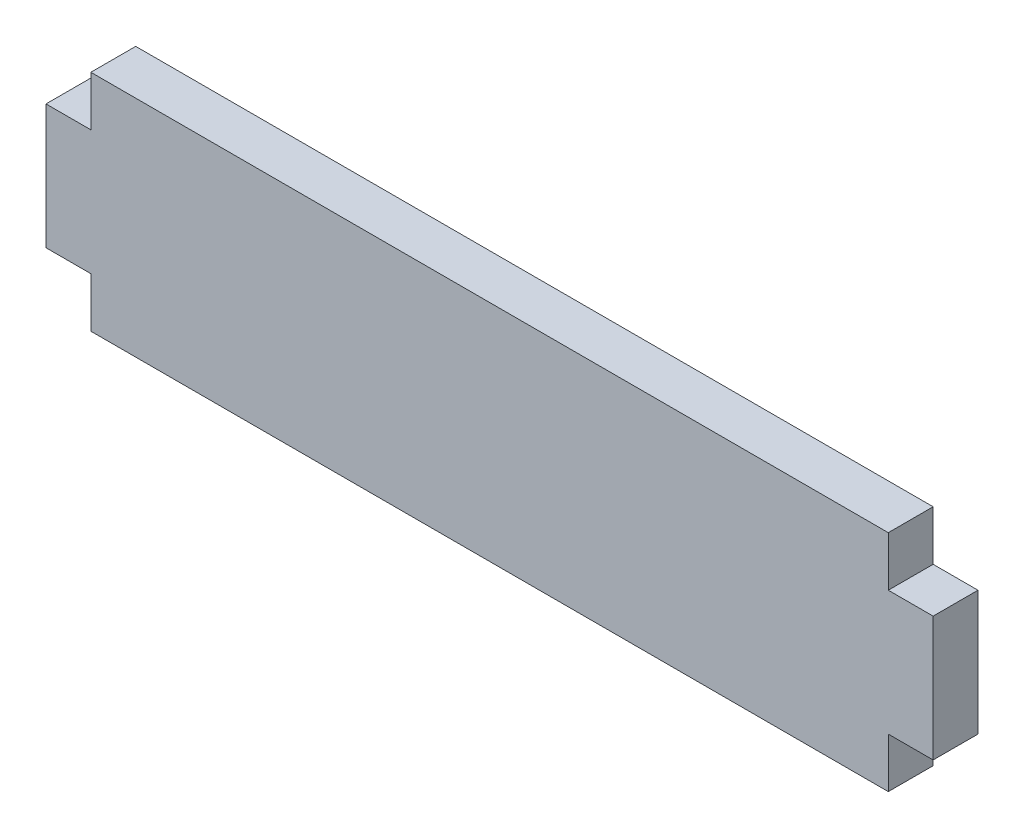
ISO-10303-21;
HEADER;
FILE_DESCRIPTION(('STEP AP214'),'2;1');
FILE_NAME('part.step','',(''),(''),'','','');
FILE_SCHEMA(('AUTOMOTIVE_DESIGN { 1 0 10303 214 1 1 1 1 }'));
ENDSEC;
DATA;
#1=APPLICATION_CONTEXT('core data for automotive mechanical design processes');
#2=APPLICATION_PROTOCOL_DEFINITION('international standard','automotive_design',2000,#1);
#3=PRODUCT_CONTEXT('',#1,'mechanical');
#4=PRODUCT('Part','Part','',(#3));
#5=PRODUCT_RELATED_PRODUCT_CATEGORY('part','',(#4));
#6=PRODUCT_DEFINITION_FORMATION('','',#4);
#7=PRODUCT_DEFINITION_CONTEXT('part definition',#1,'design');
#8=PRODUCT_DEFINITION('design','',#6,#7);
#9=PRODUCT_DEFINITION_SHAPE('','',#8);
#10=(LENGTH_UNIT() NAMED_UNIT(*) SI_UNIT(.MILLI.,.METRE.));
#11=(NAMED_UNIT(*) PLANE_ANGLE_UNIT() SI_UNIT($,.RADIAN.));
#12=(NAMED_UNIT(*) SI_UNIT($,.STERADIAN.) SOLID_ANGLE_UNIT());
#13=UNCERTAINTY_MEASURE_WITH_UNIT(LENGTH_MEASURE(1.E-05),#10,'distance_accuracy_value','');
#14=(GEOMETRIC_REPRESENTATION_CONTEXT(3) GLOBAL_UNCERTAINTY_ASSIGNED_CONTEXT((#13)) GLOBAL_UNIT_ASSIGNED_CONTEXT((#10,
#11,#12)) REPRESENTATION_CONTEXT('',''));
#15=CARTESIAN_POINT('',(0.,0.,0.));
#16=DIRECTION('',(0.,0.,1.));
#17=DIRECTION('',(1.,0.,0.));
#18=AXIS2_PLACEMENT_3D('',#15,#16,#17);
#19=CARTESIAN_POINT('',(160.,-7.10843373493977,18.));
#20=DIRECTION('',(-1.,0.,0.));
#21=DIRECTION('',(0.,0.,1.));
#22=AXIS2_PLACEMENT_3D('',#19,#20,#21);
#23=PLANE('',#22);
#24=DIRECTION('',(0.,1.,0.));
#25=VECTOR('',#24,1.);
#26=CARTESIAN_POINT('',(160.,-7.10843373493977,0.));
#27=LINE('',#26,#25);
#28=CARTESIAN_POINT('',(160.,-27.1084337349397,0.));
#29=VERTEX_POINT('',#28);
#30=CARTESIAN_POINT('',(160.,-7.10843373493977,0.));
#31=VERTEX_POINT('',#30);
#32=EDGE_CURVE('E153',#29,#31,#27,.T.);
#33=ORIENTED_EDGE('',*,*,#32,.T.);
#34=DIRECTION('',(0.,0.,-1.));
#35=VECTOR('',#34,1.);
#36=CARTESIAN_POINT('',(160.,-7.10843373493977,18.));
#37=LINE('',#36,#35);
#38=CARTESIAN_POINT('',(160.,-7.10843373493977,18.));
#39=VERTEX_POINT('',#38);
#40=EDGE_CURVE('E11',#39,#31,#37,.T.);
#41=ORIENTED_EDGE('',*,*,#40,.F.);
#42=DIRECTION('',(0.,1.,0.));
#43=VECTOR('',#42,1.);
#44=CARTESIAN_POINT('',(160.,-7.10843373493977,18.));
#45=LINE('',#44,#43);
#46=CARTESIAN_POINT('',(160.,-27.1084337349397,18.));
#47=VERTEX_POINT('',#46);
#48=EDGE_CURVE('E175',#47,#39,#45,.T.);
#49=ORIENTED_EDGE('',*,*,#48,.F.);
#50=DIRECTION('',(0.,0.,-1.));
#51=VECTOR('',#50,1.);
#52=CARTESIAN_POINT('',(160.,-27.1084337349397,18.));
#53=LINE('',#52,#51);
#54=EDGE_CURVE('E149',#47,#29,#53,.T.);
#55=ORIENTED_EDGE('',*,*,#54,.T.);
#56=EDGE_LOOP('',(#33,#41,#49,#55));
#57=FACE_BOUND('',#56,.T.);
#58=ADVANCED_FACE('F33',(#57),#23,.F.);
#59=CARTESIAN_POINT('',(160.,-7.10843373493977,18.));
#60=DIRECTION('',(0.,1.,0.));
#61=DIRECTION('',(0.,0.,1.));
#62=AXIS2_PLACEMENT_3D('',#59,#60,#61);
#63=PLANE('',#62);
#64=DIRECTION('',(1.,0.,0.));
#65=VECTOR('',#64,1.);
#66=CARTESIAN_POINT('',(160.,-7.10843373493977,0.));
#67=LINE('',#66,#65);
#68=CARTESIAN_POINT('',(178.,-7.10843373493977,0.));
#69=VERTEX_POINT('',#68);
#70=EDGE_CURVE('E156',#31,#69,#67,.T.);
#71=ORIENTED_EDGE('',*,*,#70,.T.);
#72=DIRECTION('',(0.,0.,-1.));
#73=VECTOR('',#72,1.);
#74=CARTESIAN_POINT('',(178.,-7.10843373493977,18.));
#75=LINE('',#74,#73);
#76=CARTESIAN_POINT('',(178.,-7.10843373493977,18.));
#77=VERTEX_POINT('',#76);
#78=EDGE_CURVE('E41',#77,#69,#75,.T.);
#79=ORIENTED_EDGE('',*,*,#78,.F.);
#80=DIRECTION('',(1.,0.,0.));
#81=VECTOR('',#80,1.);
#82=CARTESIAN_POINT('',(160.,-7.10843373493977,18.));
#83=LINE('',#82,#81);
#84=EDGE_CURVE('E104',#39,#77,#83,.T.);
#85=ORIENTED_EDGE('',*,*,#84,.F.);
#86=ORIENTED_EDGE('',*,*,#40,.T.);
#87=EDGE_LOOP('',(#71,#79,#85,#86));
#88=FACE_BOUND('',#87,.T.);
#89=ADVANCED_FACE('F253',(#88),#63,.F.);
#90=CARTESIAN_POINT('',(178.,42.8915662650602,18.));
#91=DIRECTION('',(-1.,0.,0.));
#92=DIRECTION('',(0.,-1.,0.));
#93=AXIS2_PLACEMENT_3D('',#90,#91,#92);
#94=PLANE('',#93);
#95=DIRECTION('',(0.,1.,0.));
#96=VECTOR('',#95,1.);
#97=CARTESIAN_POINT('',(178.,42.8915662650602,0.));
#98=LINE('',#97,#96);
#99=CARTESIAN_POINT('',(178.,42.8915662650602,0.));
#100=VERTEX_POINT('',#99);
#101=EDGE_CURVE('E158',#69,#100,#98,.T.);
#102=ORIENTED_EDGE('',*,*,#101,.T.);
#103=DIRECTION('',(0.,0.,-1.));
#104=VECTOR('',#103,1.);
#105=CARTESIAN_POINT('',(178.,42.8915662650602,18.));
#106=LINE('',#105,#104);
#107=CARTESIAN_POINT('',(178.,42.8915662650602,18.));
#108=VERTEX_POINT('',#107);
#109=EDGE_CURVE('E194',#108,#100,#106,.T.);
#110=ORIENTED_EDGE('',*,*,#109,.F.);
#111=DIRECTION('',(0.,1.,0.));
#112=VECTOR('',#111,1.);
#113=CARTESIAN_POINT('',(178.,42.8915662650602,18.));
#114=LINE('',#113,#112);
#115=EDGE_CURVE('E202',#77,#108,#114,.T.);
#116=ORIENTED_EDGE('',*,*,#115,.F.);
#117=ORIENTED_EDGE('',*,*,#78,.T.);
#118=EDGE_LOOP('',(#102,#110,#116,#117));
#119=FACE_BOUND('',#118,.T.);
#120=ADVANCED_FACE('F200',(#119),#94,.F.);
#121=CARTESIAN_POINT('',(160.,42.8915662650602,18.));
#122=DIRECTION('',(0.,-1.,0.));
#123=DIRECTION('',(0.,0.,-1.));
#124=AXIS2_PLACEMENT_3D('',#121,#122,#123);
#125=PLANE('',#124);
#126=DIRECTION('',(-1.,0.,0.));
#127=VECTOR('',#126,1.);
#128=CARTESIAN_POINT('',(160.,42.8915662650602,0.));
#129=LINE('',#128,#127);
#130=CARTESIAN_POINT('',(160.,42.8915662650602,0.));
#131=VERTEX_POINT('',#130);
#132=EDGE_CURVE('E160',#100,#131,#129,.T.);
#133=ORIENTED_EDGE('',*,*,#132,.T.);
#134=DIRECTION('',(0.,0.,-1.));
#135=VECTOR('',#134,1.);
#136=CARTESIAN_POINT('',(160.,42.8915662650602,18.));
#137=LINE('',#136,#135);
#138=CARTESIAN_POINT('',(160.,42.8915662650602,18.));
#139=VERTEX_POINT('',#138);
#140=EDGE_CURVE('E191',#139,#131,#137,.T.);
#141=ORIENTED_EDGE('',*,*,#140,.F.);
#142=DIRECTION('',(-1.,0.,0.));
#143=VECTOR('',#142,1.);
#144=CARTESIAN_POINT('',(160.,42.8915662650602,18.));
#145=LINE('',#144,#143);
#146=EDGE_CURVE('E220',#108,#139,#145,.T.);
#147=ORIENTED_EDGE('',*,*,#146,.F.);
#148=ORIENTED_EDGE('',*,*,#109,.T.);
#149=EDGE_LOOP('',(#133,#141,#147,#148));
#150=FACE_BOUND('',#149,.T.);
#151=ADVANCED_FACE('F211',(#150),#125,.F.);
#152=CARTESIAN_POINT('',(160.,62.8915662650603,18.));
#153=DIRECTION('',(-1.,0.,0.));
#154=DIRECTION('',(0.,0.,1.));
#155=AXIS2_PLACEMENT_3D('',#152,#153,#154);
#156=PLANE('',#155);
#157=DIRECTION('',(0.,1.,0.));
#158=VECTOR('',#157,1.);
#159=CARTESIAN_POINT('',(160.,62.8915662650603,0.));
#160=LINE('',#159,#158);
#161=CARTESIAN_POINT('',(160.,62.8915662650603,0.));
#162=VERTEX_POINT('',#161);
#163=EDGE_CURVE('E162',#131,#162,#160,.T.);
#164=ORIENTED_EDGE('',*,*,#163,.T.);
#165=DIRECTION('',(0.,0.,-1.));
#166=VECTOR('',#165,1.);
#167=CARTESIAN_POINT('',(160.,62.8915662650603,18.));
#168=LINE('',#167,#166);
#169=CARTESIAN_POINT('',(160.,62.8915662650603,18.));
#170=VERTEX_POINT('',#169);
#171=EDGE_CURVE('E188',#170,#162,#168,.T.);
#172=ORIENTED_EDGE('',*,*,#171,.F.);
#173=DIRECTION('',(0.,1.,0.));
#174=VECTOR('',#173,1.);
#175=CARTESIAN_POINT('',(160.,62.8915662650603,18.));
#176=LINE('',#175,#174);
#177=EDGE_CURVE('E217',#139,#170,#176,.T.);
#178=ORIENTED_EDGE('',*,*,#177,.F.);
#179=ORIENTED_EDGE('',*,*,#140,.T.);
#180=EDGE_LOOP('',(#164,#172,#178,#179));
#181=FACE_BOUND('',#180,.T.);
#182=ADVANCED_FACE('F215',(#181),#156,.F.);
#183=CARTESIAN_POINT('',(-160.,62.8915662650603,18.));
#184=DIRECTION('',(0.,-1.,0.));
#185=DIRECTION('',(0.,0.,-1.));
#186=AXIS2_PLACEMENT_3D('',#183,#184,#185);
#187=PLANE('',#186);
#188=DIRECTION('',(-1.,0.,0.));
#189=VECTOR('',#188,1.);
#190=CARTESIAN_POINT('',(-160.,62.8915662650603,0.));
#191=LINE('',#190,#189);
#192=CARTESIAN_POINT('',(-160.,62.8915662650603,0.));
#193=VERTEX_POINT('',#192);
#194=EDGE_CURVE('E164',#162,#193,#191,.T.);
#195=ORIENTED_EDGE('',*,*,#194,.T.);
#196=DIRECTION('',(0.,0.,-1.));
#197=VECTOR('',#196,1.);
#198=CARTESIAN_POINT('',(-160.,62.8915662650603,18.));
#199=LINE('',#198,#197);
#200=CARTESIAN_POINT('',(-160.,62.8915662650603,18.));
#201=VERTEX_POINT('',#200);
#202=EDGE_CURVE('E185',#201,#193,#199,.T.);
#203=ORIENTED_EDGE('',*,*,#202,.F.);
#204=DIRECTION('',(-1.,0.,0.));
#205=VECTOR('',#204,1.);
#206=CARTESIAN_POINT('',(-160.,62.8915662650603,18.));
#207=LINE('',#206,#205);
#208=EDGE_CURVE('E219',#170,#201,#207,.T.);
#209=ORIENTED_EDGE('',*,*,#208,.F.);
#210=ORIENTED_EDGE('',*,*,#171,.T.);
#211=EDGE_LOOP('',(#195,#203,#209,#210));
#212=FACE_BOUND('',#211,.T.);
#213=ADVANCED_FACE('F266',(#212),#187,.F.);
#214=CARTESIAN_POINT('',(-160.,62.8915662650603,18.));
#215=DIRECTION('',(1.,0.,0.));
#216=DIRECTION('',(0.,1.,0.));
#217=AXIS2_PLACEMENT_3D('',#214,#215,#216);
#218=PLANE('',#217);
#219=DIRECTION('',(0.,-1.,0.));
#220=VECTOR('',#219,1.);
#221=CARTESIAN_POINT('',(-160.,62.8915662650603,0.));
#222=LINE('',#221,#220);
#223=CARTESIAN_POINT('',(-160.,42.8915662650602,0.));
#224=VERTEX_POINT('',#223);
#225=EDGE_CURVE('E166',#193,#224,#222,.T.);
#226=ORIENTED_EDGE('',*,*,#225,.T.);
#227=DIRECTION('',(0.,0.,-1.));
#228=VECTOR('',#227,1.);
#229=CARTESIAN_POINT('',(-160.,42.8915662650602,18.));
#230=LINE('',#229,#228);
#231=CARTESIAN_POINT('',(-160.,42.8915662650602,18.));
#232=VERTEX_POINT('',#231);
#233=EDGE_CURVE('E182',#232,#224,#230,.T.);
#234=ORIENTED_EDGE('',*,*,#233,.F.);
#235=DIRECTION('',(0.,-1.,0.));
#236=VECTOR('',#235,1.);
#237=CARTESIAN_POINT('',(-160.,62.8915662650603,18.));
#238=LINE('',#237,#236);
#239=EDGE_CURVE('E222',#201,#232,#238,.T.);
#240=ORIENTED_EDGE('',*,*,#239,.F.);
#241=ORIENTED_EDGE('',*,*,#202,.T.);
#242=EDGE_LOOP('',(#226,#234,#240,#241));
#243=FACE_BOUND('',#242,.T.);
#244=ADVANCED_FACE('F269',(#243),#218,.F.);
#245=CARTESIAN_POINT('',(-160.,42.8915662650602,18.));
#246=DIRECTION('',(0.,-1.,0.));
#247=DIRECTION('',(0.,0.,-1.));
#248=AXIS2_PLACEMENT_3D('',#245,#246,#247);
#249=PLANE('',#248);
#250=DIRECTION('',(-1.,0.,0.));
#251=VECTOR('',#250,1.);
#252=CARTESIAN_POINT('',(-160.,42.8915662650602,0.));
#253=LINE('',#252,#251);
#254=CARTESIAN_POINT('',(-178.,42.8915662650602,0.));
#255=VERTEX_POINT('',#254);
#256=EDGE_CURVE('E168',#224,#255,#253,.T.);
#257=ORIENTED_EDGE('',*,*,#256,.T.);
#258=DIRECTION('',(0.,0.,-1.));
#259=VECTOR('',#258,1.);
#260=CARTESIAN_POINT('',(-178.,42.8915662650602,18.));
#261=LINE('',#260,#259);
#262=CARTESIAN_POINT('',(-178.,42.8915662650602,18.));
#263=VERTEX_POINT('',#262);
#264=EDGE_CURVE('E179',#263,#255,#261,.T.);
#265=ORIENTED_EDGE('',*,*,#264,.F.);
#266=DIRECTION('',(-1.,0.,0.));
#267=VECTOR('',#266,1.);
#268=CARTESIAN_POINT('',(-160.,42.8915662650602,18.));
#269=LINE('',#268,#267);
#270=EDGE_CURVE('E228',#232,#263,#269,.T.);
#271=ORIENTED_EDGE('',*,*,#270,.F.);
#272=ORIENTED_EDGE('',*,*,#233,.T.);
#273=EDGE_LOOP('',(#257,#265,#271,#272));
#274=FACE_BOUND('',#273,.T.);
#275=ADVANCED_FACE('F234',(#274),#249,.F.);
#276=CARTESIAN_POINT('',(-178.,42.8915662650602,18.));
#277=DIRECTION('',(1.,0.,0.));
#278=DIRECTION('',(0.,1.,0.));
#279=AXIS2_PLACEMENT_3D('',#276,#277,#278);
#280=PLANE('',#279);
#281=DIRECTION('',(0.,-1.,0.));
#282=VECTOR('',#281,1.);
#283=CARTESIAN_POINT('',(-178.,42.8915662650602,0.));
#284=LINE('',#283,#282);
#285=CARTESIAN_POINT('',(-178.,-7.10843373493976,0.));
#286=VERTEX_POINT('',#285);
#287=EDGE_CURVE('E170',#255,#286,#284,.T.);
#288=ORIENTED_EDGE('',*,*,#287,.T.);
#289=DIRECTION('',(0.,0.,-1.));
#290=VECTOR('',#289,1.);
#291=CARTESIAN_POINT('',(-178.,-7.10843373493976,18.));
#292=LINE('',#291,#290);
#293=CARTESIAN_POINT('',(-178.,-7.10843373493976,18.));
#294=VERTEX_POINT('',#293);
#295=EDGE_CURVE('E144',#294,#286,#292,.T.);
#296=ORIENTED_EDGE('',*,*,#295,.F.);
#297=DIRECTION('',(0.,-1.,0.));
#298=VECTOR('',#297,1.);
#299=CARTESIAN_POINT('',(-178.,42.8915662650602,18.));
#300=LINE('',#299,#298);
#301=EDGE_CURVE('E135',#263,#294,#300,.T.);
#302=ORIENTED_EDGE('',*,*,#301,.F.);
#303=ORIENTED_EDGE('',*,*,#264,.T.);
#304=EDGE_LOOP('',(#288,#296,#302,#303));
#305=FACE_BOUND('',#304,.T.);
#306=ADVANCED_FACE('F238',(#305),#280,.F.);
#307=CARTESIAN_POINT('',(-160.,-7.10843373493976,18.));
#308=DIRECTION('',(0.,1.,0.));
#309=DIRECTION('',(0.,0.,1.));
#310=AXIS2_PLACEMENT_3D('',#307,#308,#309);
#311=PLANE('',#310);
#312=DIRECTION('',(1.,0.,0.));
#313=VECTOR('',#312,1.);
#314=CARTESIAN_POINT('',(-160.,-7.10843373493976,0.));
#315=LINE('',#314,#313);
#316=CARTESIAN_POINT('',(-160.,-7.10843373493976,0.));
#317=VERTEX_POINT('',#316);
#318=EDGE_CURVE('E143',#286,#317,#315,.T.);
#319=ORIENTED_EDGE('',*,*,#318,.T.);
#320=DIRECTION('',(0.,0.,-1.));
#321=VECTOR('',#320,1.);
#322=CARTESIAN_POINT('',(-160.,-7.10843373493976,18.));
#323=LINE('',#322,#321);
#324=CARTESIAN_POINT('',(-160.,-7.10843373493976,18.));
#325=VERTEX_POINT('',#324);
#326=EDGE_CURVE('E140',#325,#317,#323,.T.);
#327=ORIENTED_EDGE('',*,*,#326,.F.);
#328=DIRECTION('',(1.,0.,0.));
#329=VECTOR('',#328,1.);
#330=CARTESIAN_POINT('',(-160.,-7.10843373493976,18.));
#331=LINE('',#330,#329);
#332=EDGE_CURVE('E129',#294,#325,#331,.T.);
#333=ORIENTED_EDGE('',*,*,#332,.F.);
#334=ORIENTED_EDGE('',*,*,#295,.T.);
#335=EDGE_LOOP('',(#319,#327,#333,#334));
#336=FACE_BOUND('',#335,.T.);
#337=ADVANCED_FACE('F141',(#336),#311,.F.);
#338=CARTESIAN_POINT('',(-160.,-7.10843373493976,18.));
#339=DIRECTION('',(1.,0.,0.));
#340=DIRECTION('',(0.,1.,0.));
#341=AXIS2_PLACEMENT_3D('',#338,#339,#340);
#342=PLANE('',#341);
#343=DIRECTION('',(0.,-1.,0.));
#344=VECTOR('',#343,1.);
#345=CARTESIAN_POINT('',(-160.,-7.10843373493976,0.));
#346=LINE('',#345,#344);
#347=CARTESIAN_POINT('',(-160.,-27.1084337349397,0.));
#348=VERTEX_POINT('',#347);
#349=EDGE_CURVE('E90',#317,#348,#346,.T.);
#350=ORIENTED_EDGE('',*,*,#349,.T.);
#351=DIRECTION('',(0.,0.,-1.));
#352=VECTOR('',#351,1.);
#353=CARTESIAN_POINT('',(-160.,-27.1084337349397,18.));
#354=LINE('',#353,#352);
#355=CARTESIAN_POINT('',(-160.,-27.1084337349397,18.));
#356=VERTEX_POINT('',#355);
#357=EDGE_CURVE('E145',#356,#348,#354,.T.);
#358=ORIENTED_EDGE('',*,*,#357,.F.);
#359=DIRECTION('',(0.,-1.,0.));
#360=VECTOR('',#359,1.);
#361=CARTESIAN_POINT('',(-160.,-7.10843373493976,18.));
#362=LINE('',#361,#360);
#363=EDGE_CURVE('E133',#325,#356,#362,.T.);
#364=ORIENTED_EDGE('',*,*,#363,.F.);
#365=ORIENTED_EDGE('',*,*,#326,.T.);
#366=EDGE_LOOP('',(#350,#358,#364,#365));
#367=FACE_BOUND('',#366,.T.);
#368=ADVANCED_FACE('F147',(#367),#342,.F.);
#369=CARTESIAN_POINT('',(-160.,-27.1084337349397,18.));
#370=DIRECTION('',(0.,1.,0.));
#371=DIRECTION('',(0.,0.,1.));
#372=AXIS2_PLACEMENT_3D('',#369,#370,#371);
#373=PLANE('',#372);
#374=DIRECTION('',(1.,0.,0.));
#375=VECTOR('',#374,1.);
#376=CARTESIAN_POINT('',(-160.,-27.1084337349397,0.));
#377=LINE('',#376,#375);
#378=EDGE_CURVE('E96',#348,#29,#377,.T.);
#379=ORIENTED_EDGE('',*,*,#378,.T.);
#380=ORIENTED_EDGE('',*,*,#54,.F.);
#381=DIRECTION('',(1.,0.,0.));
#382=VECTOR('',#381,1.);
#383=CARTESIAN_POINT('',(-160.,-27.1084337349397,18.));
#384=LINE('',#383,#382);
#385=EDGE_CURVE('E49',#356,#47,#384,.T.);
#386=ORIENTED_EDGE('',*,*,#385,.F.);
#387=ORIENTED_EDGE('',*,*,#357,.T.);
#388=EDGE_LOOP('',(#379,#380,#386,#387));
#389=FACE_BOUND('',#388,.T.);
#390=ADVANCED_FACE('F242',(#389),#373,.F.);
#391=CARTESIAN_POINT('',(0.,0.,18.));
#392=DIRECTION('',(0.,0.,1.));
#393=DIRECTION('',(1.,0.,0.));
#394=AXIS2_PLACEMENT_3D('',#391,#392,#393);
#395=PLANE('',#394);
#396=ORIENTED_EDGE('',*,*,#48,.T.);
#397=ORIENTED_EDGE('',*,*,#84,.T.);
#398=ORIENTED_EDGE('',*,*,#115,.T.);
#399=ORIENTED_EDGE('',*,*,#146,.T.);
#400=ORIENTED_EDGE('',*,*,#177,.T.);
#401=ORIENTED_EDGE('',*,*,#208,.T.);
#402=ORIENTED_EDGE('',*,*,#239,.T.);
#403=ORIENTED_EDGE('',*,*,#270,.T.);
#404=ORIENTED_EDGE('',*,*,#301,.T.);
#405=ORIENTED_EDGE('',*,*,#332,.T.);
#406=ORIENTED_EDGE('',*,*,#363,.T.);
#407=ORIENTED_EDGE('',*,*,#385,.T.);
#408=EDGE_LOOP('',(#396,#397,#398,#399,#400,#401,#402,#403,#404,#405,#406,#407));
#409=FACE_BOUND('',#408,.T.);
#410=ADVANCED_FACE('F131',(#409),#395,.T.);
#411=CARTESIAN_POINT('',(0.,0.,0.));
#412=DIRECTION('',(0.,0.,1.));
#413=DIRECTION('',(1.,0.,0.));
#414=AXIS2_PLACEMENT_3D('',#411,#412,#413);
#415=PLANE('',#414);
#416=ORIENTED_EDGE('',*,*,#32,.F.);
#417=ORIENTED_EDGE('',*,*,#378,.F.);
#418=ORIENTED_EDGE('',*,*,#349,.F.);
#419=ORIENTED_EDGE('',*,*,#318,.F.);
#420=ORIENTED_EDGE('',*,*,#287,.F.);
#421=ORIENTED_EDGE('',*,*,#256,.F.);
#422=ORIENTED_EDGE('',*,*,#225,.F.);
#423=ORIENTED_EDGE('',*,*,#194,.F.);
#424=ORIENTED_EDGE('',*,*,#163,.F.);
#425=ORIENTED_EDGE('',*,*,#132,.F.);
#426=ORIENTED_EDGE('',*,*,#101,.F.);
#427=ORIENTED_EDGE('',*,*,#70,.F.);
#428=EDGE_LOOP('',(#416,#417,#418,#419,#420,#421,#422,#423,#424,#425,#426,#427));
#429=FACE_BOUND('',#428,.T.);
#430=ADVANCED_FACE('F206',(#429),#415,.F.);
#431=CLOSED_SHELL('',(#58,#89,#120,#151,#182,#213,#244,#275,#306,#337,#368,#390,#410,#430));
#432=MANIFOLD_SOLID_BREP('B2',#431);
#433=ADVANCED_BREP_SHAPE_REPRESENTATION('',(#18,#432),#14);
#434=SHAPE_DEFINITION_REPRESENTATION(#9,#433);
ENDSEC;
END-ISO-10303-21;
